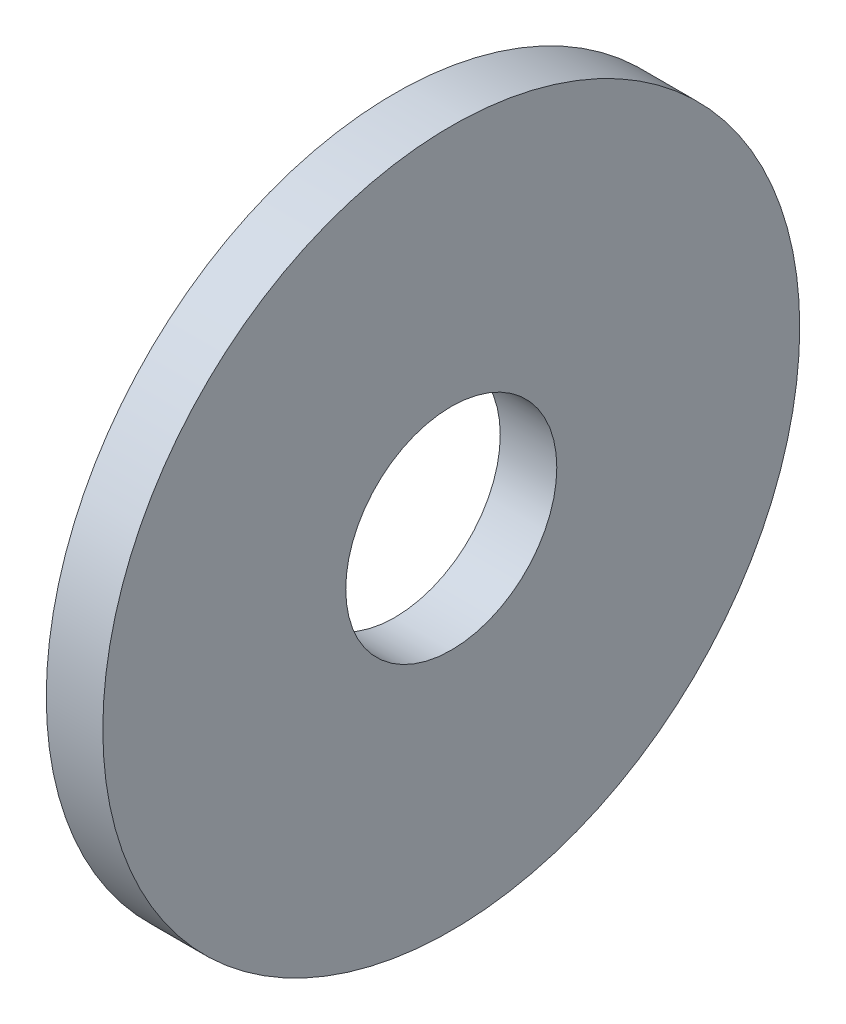
ISO-10303-21;
HEADER;
FILE_DESCRIPTION(('STEP AP214'),'2;1');
FILE_NAME('part.step','',(''),(''),'','','');
FILE_SCHEMA(('AUTOMOTIVE_DESIGN { 1 0 10303 214 1 1 1 1 }'));
ENDSEC;
DATA;
#1=APPLICATION_CONTEXT('core data for automotive mechanical design processes');
#2=APPLICATION_PROTOCOL_DEFINITION('international standard','automotive_design',2000,#1);
#3=PRODUCT_CONTEXT('',#1,'mechanical');
#4=PRODUCT('Part','Part','',(#3));
#5=PRODUCT_RELATED_PRODUCT_CATEGORY('part','',(#4));
#6=PRODUCT_DEFINITION_FORMATION('','',#4);
#7=PRODUCT_DEFINITION_CONTEXT('part definition',#1,'design');
#8=PRODUCT_DEFINITION('design','',#6,#7);
#9=PRODUCT_DEFINITION_SHAPE('','',#8);
#10=(LENGTH_UNIT() NAMED_UNIT(*) SI_UNIT(.MILLI.,.METRE.));
#11=(NAMED_UNIT(*) PLANE_ANGLE_UNIT() SI_UNIT($,.RADIAN.));
#12=(NAMED_UNIT(*) SI_UNIT($,.STERADIAN.) SOLID_ANGLE_UNIT());
#13=UNCERTAINTY_MEASURE_WITH_UNIT(LENGTH_MEASURE(1.E-05),#10,'distance_accuracy_value','');
#14=(GEOMETRIC_REPRESENTATION_CONTEXT(3) GLOBAL_UNCERTAINTY_ASSIGNED_CONTEXT((#13)) GLOBAL_UNIT_ASSIGNED_CONTEXT((#10,
#11,#12)) REPRESENTATION_CONTEXT('',''));
#15=CARTESIAN_POINT('',(0.,0.,0.));
#16=DIRECTION('',(0.,0.,1.));
#17=DIRECTION('',(1.,0.,0.));
#18=AXIS2_PLACEMENT_3D('',#15,#16,#17);
#19=CARTESIAN_POINT('',(1.8034,0.,0.));
#20=DIRECTION('',(1.,0.,0.));
#21=DIRECTION('',(0.,0.,-1.));
#22=AXIS2_PLACEMENT_3D('',#19,#20,#21);
#23=PLANE('',#22);
#24=CARTESIAN_POINT('',(1.8034,0.,0.));
#25=DIRECTION('',(1.,0.,0.));
#26=DIRECTION('',(0.,0.,-1.));
#27=AXIS2_PLACEMENT_3D('',#24,#25,#26);
#28=CIRCLE('',#27,11.1125);
#29=CARTESIAN_POINT('',(1.8034,0.,-11.1125));
#30=VERTEX_POINT('',#29);
#31=EDGE_CURVE('E10',#30,#30,#28,.T.);
#32=ORIENTED_EDGE('',*,*,#31,.T.);
#33=EDGE_LOOP('',(#32));
#34=FACE_BOUND('',#33,.T.);
#35=CARTESIAN_POINT('',(1.8034,0.,0.));
#36=DIRECTION('',(1.,0.,0.));
#37=DIRECTION('',(0.,0.,-1.));
#38=AXIS2_PLACEMENT_3D('',#35,#36,#37);
#39=CIRCLE('',#38,3.3655);
#40=CARTESIAN_POINT('',(1.8034,0.,-3.3655));
#41=VERTEX_POINT('',#40);
#42=EDGE_CURVE('E43',#41,#41,#39,.T.);
#43=ORIENTED_EDGE('',*,*,#42,.F.);
#44=EDGE_LOOP('',(#43));
#45=FACE_BOUND('',#44,.T.);
#46=ADVANCED_FACE('F32',(#34,#45),#23,.T.);
#47=CARTESIAN_POINT('',(0.,0.,0.));
#48=DIRECTION('',(1.,0.,0.));
#49=DIRECTION('',(0.,0.,-1.));
#50=AXIS2_PLACEMENT_3D('',#47,#48,#49);
#51=PLANE('',#50);
#52=CARTESIAN_POINT('',(0.,0.,0.));
#53=DIRECTION('',(1.,0.,0.));
#54=DIRECTION('',(0.,0.,-1.));
#55=AXIS2_PLACEMENT_3D('',#52,#53,#54);
#56=CIRCLE('',#55,11.1125);
#57=CARTESIAN_POINT('',(0.,0.,-11.1125));
#58=VERTEX_POINT('',#57);
#59=EDGE_CURVE('E36',#58,#58,#56,.T.);
#60=ORIENTED_EDGE('',*,*,#59,.F.);
#61=EDGE_LOOP('',(#60));
#62=FACE_BOUND('',#61,.T.);
#63=CARTESIAN_POINT('',(0.,0.,0.));
#64=DIRECTION('',(1.,0.,0.));
#65=DIRECTION('',(0.,0.,-1.));
#66=AXIS2_PLACEMENT_3D('',#63,#64,#65);
#67=CIRCLE('',#66,3.3655);
#68=CARTESIAN_POINT('',(0.,0.,-3.3655));
#69=VERTEX_POINT('',#68);
#70=EDGE_CURVE('E45',#69,#69,#67,.T.);
#71=ORIENTED_EDGE('',*,*,#70,.T.);
#72=EDGE_LOOP('',(#71));
#73=FACE_BOUND('',#72,.T.);
#74=ADVANCED_FACE('F55',(#62,#73),#51,.F.);
#75=CARTESIAN_POINT('',(1.8034,0.,0.));
#76=DIRECTION('',(-1.,0.,0.));
#77=DIRECTION('',(0.,0.,1.));
#78=AXIS2_PLACEMENT_3D('',#75,#76,#77);
#79=CYLINDRICAL_SURFACE('',#78,11.1125);
#80=ORIENTED_EDGE('',*,*,#31,.F.);
#81=EDGE_LOOP('',(#80));
#82=FACE_BOUND('',#81,.T.);
#83=ORIENTED_EDGE('',*,*,#59,.T.);
#84=EDGE_LOOP('',(#83));
#85=FACE_BOUND('',#84,.T.);
#86=ADVANCED_FACE('F34',(#82,#85),#79,.T.);
#87=CARTESIAN_POINT('',(1.8034,0.,0.));
#88=DIRECTION('',(-1.,0.,0.));
#89=DIRECTION('',(0.,0.,1.));
#90=AXIS2_PLACEMENT_3D('',#87,#88,#89);
#91=CYLINDRICAL_SURFACE('',#90,3.3655);
#92=ORIENTED_EDGE('',*,*,#42,.T.);
#93=EDGE_LOOP('',(#92));
#94=FACE_BOUND('',#93,.T.);
#95=ORIENTED_EDGE('',*,*,#70,.F.);
#96=EDGE_LOOP('',(#95));
#97=FACE_BOUND('',#96,.T.);
#98=ADVANCED_FACE('F51',(#94,#97),#91,.F.);
#99=CLOSED_SHELL('',(#46,#74,#86,#98));
#100=MANIFOLD_SOLID_BREP('B2',#99);
#101=ADVANCED_BREP_SHAPE_REPRESENTATION('',(#18,#100),#14);
#102=SHAPE_DEFINITION_REPRESENTATION(#9,#101);
ENDSEC;
END-ISO-10303-21;
